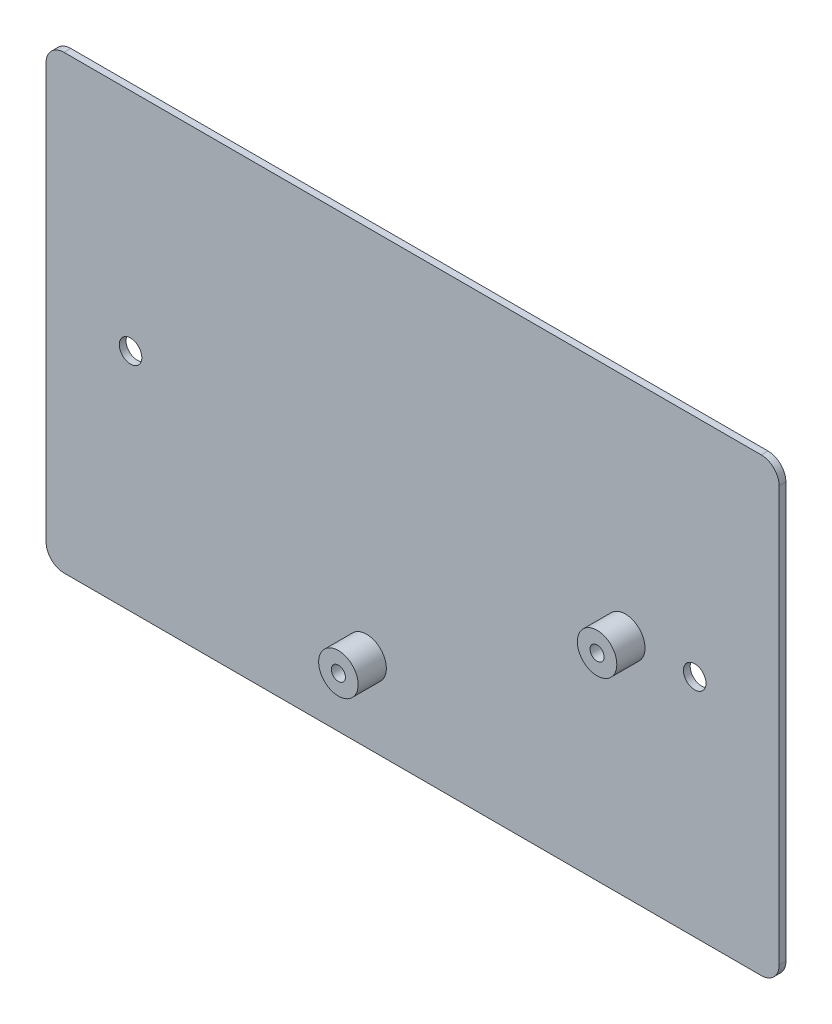
ISO-10303-21;
HEADER;
FILE_DESCRIPTION(('STEP AP214'),'2;1');
FILE_NAME('part.step','',(''),(''),'','','');
FILE_SCHEMA(('AUTOMOTIVE_DESIGN { 1 0 10303 214 1 1 1 1 }'));
ENDSEC;
DATA;
#1=APPLICATION_CONTEXT('core data for automotive mechanical design processes');
#2=APPLICATION_PROTOCOL_DEFINITION('international standard','automotive_design',2000,#1);
#3=PRODUCT_CONTEXT('',#1,'mechanical');
#4=PRODUCT('Part','Part','',(#3));
#5=PRODUCT_RELATED_PRODUCT_CATEGORY('part','',(#4));
#6=PRODUCT_DEFINITION_FORMATION('','',#4);
#7=PRODUCT_DEFINITION_CONTEXT('part definition',#1,'design');
#8=PRODUCT_DEFINITION('design','',#6,#7);
#9=PRODUCT_DEFINITION_SHAPE('','',#8);
#10=(LENGTH_UNIT() NAMED_UNIT(*) SI_UNIT(.MILLI.,.METRE.));
#11=(NAMED_UNIT(*) PLANE_ANGLE_UNIT() SI_UNIT($,.RADIAN.));
#12=(NAMED_UNIT(*) SI_UNIT($,.STERADIAN.) SOLID_ANGLE_UNIT());
#13=UNCERTAINTY_MEASURE_WITH_UNIT(LENGTH_MEASURE(1.E-05),#10,'distance_accuracy_value','');
#14=(GEOMETRIC_REPRESENTATION_CONTEXT(3) GLOBAL_UNCERTAINTY_ASSIGNED_CONTEXT((#13)) GLOBAL_UNIT_ASSIGNED_CONTEXT((#10,
#11,#12)) REPRESENTATION_CONTEXT('',''));
#15=CARTESIAN_POINT('',(0.,0.,0.));
#16=DIRECTION('',(0.,0.,1.));
#17=DIRECTION('',(1.,0.,0.));
#18=AXIS2_PLACEMENT_3D('',#15,#16,#17);
#19=CARTESIAN_POINT('',(0.,0.,1.2));
#20=DIRECTION('',(0.,0.,-1.));
#21=DIRECTION('',(-1.,0.,0.));
#22=AXIS2_PLACEMENT_3D('',#19,#20,#21);
#23=PLANE('',#22);
#24=CARTESIAN_POINT('',(-8.15692859579541,-26.04,1.2));
#25=DIRECTION('',(0.,0.,-1.));
#26=DIRECTION('',(-1.,0.,0.));
#27=AXIS2_PLACEMENT_3D('',#24,#25,#26);
#28=CIRCLE('',#27,3.5);
#29=CARTESIAN_POINT('',(-11.6569285957954,-26.04,1.2));
#30=VERTEX_POINT('',#29);
#31=EDGE_CURVE('E48',#30,#30,#28,.F.);
#32=ORIENTED_EDGE('',*,*,#31,.F.);
#33=EDGE_LOOP('',(#32));
#34=FACE_BOUND('',#33,.T.);
#35=CARTESIAN_POINT('',(-50.,0.,1.2));
#36=DIRECTION('',(0.,0.,1.));
#37=DIRECTION('',(1.,0.,0.));
#38=AXIS2_PLACEMENT_3D('',#35,#36,#37);
#39=CIRCLE('',#38,2.);
#40=CARTESIAN_POINT('',(-48.,0.,1.2));
#41=VERTEX_POINT('',#40);
#42=EDGE_CURVE('E197',#41,#41,#39,.T.);
#43=ORIENTED_EDGE('',*,*,#42,.F.);
#44=EDGE_LOOP('',(#43));
#45=FACE_BOUND('',#44,.T.);
#46=CARTESIAN_POINT('',(50.,0.,1.2));
#47=DIRECTION('',(0.,0.,1.));
#48=DIRECTION('',(-1.,0.,0.));
#49=AXIS2_PLACEMENT_3D('',#46,#47,#48);
#50=CIRCLE('',#49,2.);
#51=CARTESIAN_POINT('',(48.,0.,1.2));
#52=VERTEX_POINT('',#51);
#53=EDGE_CURVE('E200',#52,#52,#50,.T.);
#54=ORIENTED_EDGE('',*,*,#53,.F.);
#55=EDGE_LOOP('',(#54));
#56=FACE_BOUND('',#55,.T.);
#57=DIRECTION('',(-1.,0.,0.));
#58=VECTOR('',#57,1.);
#59=CARTESIAN_POINT('',(-64.965,39.965,1.2));
#60=LINE('',#59,#58);
#61=CARTESIAN_POINT('',(61.79,39.965,1.2));
#62=VERTEX_POINT('',#61);
#63=CARTESIAN_POINT('',(-61.79,39.965,1.2));
#64=VERTEX_POINT('',#63);
#65=EDGE_CURVE('E204',#62,#64,#60,.T.);
#66=ORIENTED_EDGE('',*,*,#65,.T.);
#67=CARTESIAN_POINT('',(-61.79,36.79,1.2));
#68=DIRECTION('',(0.,0.,-1.));
#69=DIRECTION('',(-1.,0.,0.));
#70=AXIS2_PLACEMENT_3D('',#67,#68,#69);
#71=CIRCLE('',#70,3.175);
#72=CARTESIAN_POINT('',(-64.965,36.79,1.2));
#73=VERTEX_POINT('',#72);
#74=EDGE_CURVE('E169',#64,#73,#71,.F.);
#75=ORIENTED_EDGE('',*,*,#74,.T.);
#76=DIRECTION('',(0.,-1.,0.));
#77=VECTOR('',#76,1.);
#78=CARTESIAN_POINT('',(-64.965,-39.965,1.2));
#79=LINE('',#78,#77);
#80=CARTESIAN_POINT('',(-64.965,-36.79,1.2));
#81=VERTEX_POINT('',#80);
#82=EDGE_CURVE('E127',#73,#81,#79,.T.);
#83=ORIENTED_EDGE('',*,*,#82,.T.);
#84=CARTESIAN_POINT('',(-61.79,-36.79,1.2));
#85=DIRECTION('',(0.,0.,-1.));
#86=DIRECTION('',(-1.,0.,0.));
#87=AXIS2_PLACEMENT_3D('',#84,#85,#86);
#88=CIRCLE('',#87,3.175);
#89=CARTESIAN_POINT('',(-61.79,-39.965,1.2));
#90=VERTEX_POINT('',#89);
#91=EDGE_CURVE('E62',#81,#90,#88,.F.);
#92=ORIENTED_EDGE('',*,*,#91,.T.);
#93=DIRECTION('',(1.,0.,0.));
#94=VECTOR('',#93,1.);
#95=CARTESIAN_POINT('',(-64.965,-39.965,1.2));
#96=LINE('',#95,#94);
#97=CARTESIAN_POINT('',(61.79,-39.965,1.2));
#98=VERTEX_POINT('',#97);
#99=EDGE_CURVE('E147',#90,#98,#96,.T.);
#100=ORIENTED_EDGE('',*,*,#99,.T.);
#101=CARTESIAN_POINT('',(61.79,-36.79,1.2));
#102=DIRECTION('',(0.,0.,-1.));
#103=DIRECTION('',(-1.,0.,0.));
#104=AXIS2_PLACEMENT_3D('',#101,#102,#103);
#105=CIRCLE('',#104,3.175);
#106=CARTESIAN_POINT('',(64.965,-36.79,1.2));
#107=VERTEX_POINT('',#106);
#108=EDGE_CURVE('E164',#98,#107,#105,.F.);
#109=ORIENTED_EDGE('',*,*,#108,.T.);
#110=DIRECTION('',(0.,1.,0.));
#111=VECTOR('',#110,1.);
#112=CARTESIAN_POINT('',(64.965,-39.965,1.2));
#113=LINE('',#112,#111);
#114=CARTESIAN_POINT('',(64.965,36.79,1.2));
#115=VERTEX_POINT('',#114);
#116=EDGE_CURVE('E140',#107,#115,#113,.T.);
#117=ORIENTED_EDGE('',*,*,#116,.T.);
#118=CARTESIAN_POINT('',(61.79,36.79,1.2));
#119=DIRECTION('',(0.,0.,-1.));
#120=DIRECTION('',(-1.,0.,0.));
#121=AXIS2_PLACEMENT_3D('',#118,#119,#120);
#122=CIRCLE('',#121,3.175);
#123=EDGE_CURVE('E161',#115,#62,#122,.F.);
#124=ORIENTED_EDGE('',*,*,#123,.T.);
#125=EDGE_LOOP('',(#66,#75,#83,#92,#100,#109,#117,#124));
#126=FACE_BOUND('',#125,.T.);
#127=CARTESIAN_POINT('',(37.6930714042046,0.,1.2));
#128=DIRECTION('',(0.,0.,-1.));
#129=DIRECTION('',(-1.,0.,0.));
#130=AXIS2_PLACEMENT_3D('',#127,#128,#129);
#131=CIRCLE('',#130,3.5);
#132=CARTESIAN_POINT('',(34.1930714042046,0.,1.2));
#133=VERTEX_POINT('',#132);
#134=EDGE_CURVE('E11',#133,#133,#131,.F.);
#135=ORIENTED_EDGE('',*,*,#134,.F.);
#136=EDGE_LOOP('',(#135));
#137=FACE_BOUND('',#136,.T.);
#138=ADVANCED_FACE('F39',(#34,#45,#56,#126,#137),#23,.F.);
#139=CARTESIAN_POINT('',(64.965,-39.965,1.2));
#140=DIRECTION('',(-1.,0.,0.));
#141=DIRECTION('',(0.,0.,1.));
#142=AXIS2_PLACEMENT_3D('',#139,#140,#141);
#143=PLANE('',#142);
#144=ORIENTED_EDGE('',*,*,#116,.F.);
#145=DIRECTION('',(0.,0.,-1.));
#146=VECTOR('',#145,1.);
#147=CARTESIAN_POINT('',(64.965,-36.79,1.2));
#148=LINE('',#147,#146);
#149=CARTESIAN_POINT('',(64.965,-36.79,0.));
#150=VERTEX_POINT('',#149);
#151=EDGE_CURVE('E181',#107,#150,#148,.T.);
#152=ORIENTED_EDGE('',*,*,#151,.T.);
#153=DIRECTION('',(0.,1.,0.));
#154=VECTOR('',#153,1.);
#155=CARTESIAN_POINT('',(64.965,-39.965,0.));
#156=LINE('',#155,#154);
#157=CARTESIAN_POINT('',(64.965,36.79,0.));
#158=VERTEX_POINT('',#157);
#159=EDGE_CURVE('E142',#150,#158,#156,.T.);
#160=ORIENTED_EDGE('',*,*,#159,.T.);
#161=DIRECTION('',(0.,0.,-1.));
#162=VECTOR('',#161,1.);
#163=CARTESIAN_POINT('',(64.965,36.79,1.2));
#164=LINE('',#163,#162);
#165=EDGE_CURVE('E178',#158,#115,#164,.F.);
#166=ORIENTED_EDGE('',*,*,#165,.T.);
#167=EDGE_LOOP('',(#144,#152,#160,#166));
#168=FACE_BOUND('',#167,.T.);
#169=ADVANCED_FACE('F192',(#168),#143,.F.);
#170=CARTESIAN_POINT('',(-64.965,39.965,1.2));
#171=DIRECTION('',(0.,-1.,0.));
#172=DIRECTION('',(0.,0.,-1.));
#173=AXIS2_PLACEMENT_3D('',#170,#171,#172);
#174=PLANE('',#173);
#175=DIRECTION('',(-1.,0.,0.));
#176=VECTOR('',#175,1.);
#177=CARTESIAN_POINT('',(-64.965,39.965,0.));
#178=LINE('',#177,#176);
#179=CARTESIAN_POINT('',(61.79,39.965,0.));
#180=VERTEX_POINT('',#179);
#181=CARTESIAN_POINT('',(-61.79,39.965,0.));
#182=VERTEX_POINT('',#181);
#183=EDGE_CURVE('E136',#180,#182,#178,.T.);
#184=ORIENTED_EDGE('',*,*,#183,.T.);
#185=DIRECTION('',(0.,0.,-1.));
#186=VECTOR('',#185,1.);
#187=CARTESIAN_POINT('',(-61.79,39.965,1.2));
#188=LINE('',#187,#186);
#189=EDGE_CURVE('E112',#182,#64,#188,.F.);
#190=ORIENTED_EDGE('',*,*,#189,.T.);
#191=ORIENTED_EDGE('',*,*,#65,.F.);
#192=DIRECTION('',(0.,0.,-1.));
#193=VECTOR('',#192,1.);
#194=CARTESIAN_POINT('',(61.79,39.965,1.2));
#195=LINE('',#194,#193);
#196=EDGE_CURVE('E118',#62,#180,#195,.T.);
#197=ORIENTED_EDGE('',*,*,#196,.T.);
#198=EDGE_LOOP('',(#184,#190,#191,#197));
#199=FACE_BOUND('',#198,.T.);
#200=ADVANCED_FACE('F250',(#199),#174,.F.);
#201=CARTESIAN_POINT('',(-64.965,-39.965,1.2));
#202=DIRECTION('',(1.,0.,0.));
#203=DIRECTION('',(0.,0.,-1.));
#204=AXIS2_PLACEMENT_3D('',#201,#202,#203);
#205=PLANE('',#204);
#206=ORIENTED_EDGE('',*,*,#82,.F.);
#207=DIRECTION('',(0.,0.,-1.));
#208=VECTOR('',#207,1.);
#209=CARTESIAN_POINT('',(-64.965,36.79,1.2));
#210=LINE('',#209,#208);
#211=CARTESIAN_POINT('',(-64.965,36.79,0.));
#212=VERTEX_POINT('',#211);
#213=EDGE_CURVE('E111',#73,#212,#210,.T.);
#214=ORIENTED_EDGE('',*,*,#213,.T.);
#215=DIRECTION('',(0.,-1.,0.));
#216=VECTOR('',#215,1.);
#217=CARTESIAN_POINT('',(-64.965,-39.965,0.));
#218=LINE('',#217,#216);
#219=CARTESIAN_POINT('',(-64.965,-36.79,0.));
#220=VERTEX_POINT('',#219);
#221=EDGE_CURVE('E125',#212,#220,#218,.T.);
#222=ORIENTED_EDGE('',*,*,#221,.T.);
#223=DIRECTION('',(0.,0.,-1.));
#224=VECTOR('',#223,1.);
#225=CARTESIAN_POINT('',(-64.965,-36.79,1.2));
#226=LINE('',#225,#224);
#227=EDGE_CURVE('E130',#220,#81,#226,.F.);
#228=ORIENTED_EDGE('',*,*,#227,.T.);
#229=EDGE_LOOP('',(#206,#214,#222,#228));
#230=FACE_BOUND('',#229,.T.);
#231=ADVANCED_FACE('F124',(#230),#205,.F.);
#232=CARTESIAN_POINT('',(-64.965,-39.965,1.2));
#233=DIRECTION('',(0.,1.,0.));
#234=DIRECTION('',(0.,0.,1.));
#235=AXIS2_PLACEMENT_3D('',#232,#233,#234);
#236=PLANE('',#235);
#237=ORIENTED_EDGE('',*,*,#99,.F.);
#238=DIRECTION('',(0.,0.,-1.));
#239=VECTOR('',#238,1.);
#240=CARTESIAN_POINT('',(-61.79,-39.965,1.2));
#241=LINE('',#240,#239);
#242=CARTESIAN_POINT('',(-61.79,-39.965,0.));
#243=VERTEX_POINT('',#242);
#244=EDGE_CURVE('E174',#90,#243,#241,.T.);
#245=ORIENTED_EDGE('',*,*,#244,.T.);
#246=DIRECTION('',(1.,0.,0.));
#247=VECTOR('',#246,1.);
#248=CARTESIAN_POINT('',(-64.965,-39.965,0.));
#249=LINE('',#248,#247);
#250=CARTESIAN_POINT('',(61.79,-39.965,0.));
#251=VERTEX_POINT('',#250);
#252=EDGE_CURVE('E135',#243,#251,#249,.T.);
#253=ORIENTED_EDGE('',*,*,#252,.T.);
#254=DIRECTION('',(0.,0.,-1.));
#255=VECTOR('',#254,1.);
#256=CARTESIAN_POINT('',(61.79,-39.965,1.2));
#257=LINE('',#256,#255);
#258=EDGE_CURVE('E55',#251,#98,#257,.F.);
#259=ORIENTED_EDGE('',*,*,#258,.T.);
#260=EDGE_LOOP('',(#237,#245,#253,#259));
#261=FACE_BOUND('',#260,.T.);
#262=ADVANCED_FACE('F244',(#261),#236,.F.);
#263=CARTESIAN_POINT('',(0.,0.,0.));
#264=DIRECTION('',(0.,0.,-1.));
#265=DIRECTION('',(-1.,0.,0.));
#266=AXIS2_PLACEMENT_3D('',#263,#264,#265);
#267=PLANE('',#266);
#268=CARTESIAN_POINT('',(-8.15692859579541,-26.04,0.));
#269=DIRECTION('',(0.,0.,-1.));
#270=DIRECTION('',(-1.,0.,0.));
#271=AXIS2_PLACEMENT_3D('',#268,#269,#270);
#272=CIRCLE('',#271,1.25);
#273=CARTESIAN_POINT('',(-9.40692859579541,-26.04,0.));
#274=VERTEX_POINT('',#273);
#275=EDGE_CURVE('E303',#274,#274,#272,.F.);
#276=ORIENTED_EDGE('',*,*,#275,.T.);
#277=EDGE_LOOP('',(#276));
#278=FACE_BOUND('',#277,.T.);
#279=CARTESIAN_POINT('',(37.6930714042046,0.,0.));
#280=DIRECTION('',(0.,0.,-1.));
#281=DIRECTION('',(-1.,0.,0.));
#282=AXIS2_PLACEMENT_3D('',#279,#280,#281);
#283=CIRCLE('',#282,1.25);
#284=CARTESIAN_POINT('',(36.4430714042046,0.,0.));
#285=VERTEX_POINT('',#284);
#286=EDGE_CURVE('E297',#285,#285,#283,.F.);
#287=ORIENTED_EDGE('',*,*,#286,.T.);
#288=EDGE_LOOP('',(#287));
#289=FACE_BOUND('',#288,.T.);
#290=CARTESIAN_POINT('',(-50.,0.,0.));
#291=DIRECTION('',(0.,0.,-1.));
#292=DIRECTION('',(-1.,0.,0.));
#293=AXIS2_PLACEMENT_3D('',#290,#291,#292);
#294=CIRCLE('',#293,2.);
#295=CARTESIAN_POINT('',(-52.,0.,0.));
#296=VERTEX_POINT('',#295);
#297=EDGE_CURVE('E290',#296,#296,#294,.F.);
#298=ORIENTED_EDGE('',*,*,#297,.T.);
#299=EDGE_LOOP('',(#298));
#300=FACE_BOUND('',#299,.T.);
#301=CARTESIAN_POINT('',(50.,0.,0.));
#302=DIRECTION('',(0.,0.,-1.));
#303=DIRECTION('',(-1.,0.,0.));
#304=AXIS2_PLACEMENT_3D('',#301,#302,#303);
#305=CIRCLE('',#304,2.);
#306=CARTESIAN_POINT('',(48.,0.,0.));
#307=VERTEX_POINT('',#306);
#308=EDGE_CURVE('E282',#307,#307,#305,.F.);
#309=ORIENTED_EDGE('',*,*,#308,.T.);
#310=EDGE_LOOP('',(#309));
#311=FACE_BOUND('',#310,.T.);
#312=ORIENTED_EDGE('',*,*,#221,.F.);
#313=CARTESIAN_POINT('',(-61.79,36.79,0.));
#314=DIRECTION('',(0.,0.,-1.));
#315=DIRECTION('',(-1.,0.,0.));
#316=AXIS2_PLACEMENT_3D('',#313,#314,#315);
#317=CIRCLE('',#316,3.175);
#318=EDGE_CURVE('E107',#212,#182,#317,.T.);
#319=ORIENTED_EDGE('',*,*,#318,.T.);
#320=ORIENTED_EDGE('',*,*,#183,.F.);
#321=CARTESIAN_POINT('',(61.79,36.79,0.));
#322=DIRECTION('',(0.,0.,-1.));
#323=DIRECTION('',(-1.,0.,0.));
#324=AXIS2_PLACEMENT_3D('',#321,#322,#323);
#325=CIRCLE('',#324,3.175);
#326=EDGE_CURVE('E129',#180,#158,#325,.T.);
#327=ORIENTED_EDGE('',*,*,#326,.T.);
#328=ORIENTED_EDGE('',*,*,#159,.F.);
#329=CARTESIAN_POINT('',(61.79,-36.79,0.));
#330=DIRECTION('',(0.,0.,-1.));
#331=DIRECTION('',(-1.,0.,0.));
#332=AXIS2_PLACEMENT_3D('',#329,#330,#331);
#333=CIRCLE('',#332,3.175);
#334=EDGE_CURVE('E151',#150,#251,#333,.T.);
#335=ORIENTED_EDGE('',*,*,#334,.T.);
#336=ORIENTED_EDGE('',*,*,#252,.F.);
#337=CARTESIAN_POINT('',(-61.79,-36.79,0.));
#338=DIRECTION('',(0.,0.,-1.));
#339=DIRECTION('',(-1.,0.,0.));
#340=AXIS2_PLACEMENT_3D('',#337,#338,#339);
#341=CIRCLE('',#340,3.175);
#342=EDGE_CURVE('E119',#243,#220,#341,.T.);
#343=ORIENTED_EDGE('',*,*,#342,.T.);
#344=EDGE_LOOP('',(#312,#319,#320,#327,#328,#335,#336,#343));
#345=FACE_BOUND('',#344,.T.);
#346=ADVANCED_FACE('F132',(#278,#289,#300,#311,#345),#267,.T.);
#347=CARTESIAN_POINT('',(-61.79,36.79,1.2));
#348=DIRECTION('',(0.,0.,-1.));
#349=DIRECTION('',(-1.,0.,0.));
#350=AXIS2_PLACEMENT_3D('',#347,#348,#349);
#351=CYLINDRICAL_SURFACE('',#350,3.175);
#352=ORIENTED_EDGE('',*,*,#74,.F.);
#353=ORIENTED_EDGE('',*,*,#189,.F.);
#354=ORIENTED_EDGE('',*,*,#318,.F.);
#355=ORIENTED_EDGE('',*,*,#213,.F.);
#356=EDGE_LOOP('',(#352,#353,#354,#355));
#357=FACE_BOUND('',#356,.T.);
#358=ADVANCED_FACE('F110',(#357),#351,.T.);
#359=CARTESIAN_POINT('',(-61.79,-36.79,1.2));
#360=DIRECTION('',(0.,0.,-1.));
#361=DIRECTION('',(-1.,0.,0.));
#362=AXIS2_PLACEMENT_3D('',#359,#360,#361);
#363=CYLINDRICAL_SURFACE('',#362,3.175);
#364=ORIENTED_EDGE('',*,*,#91,.F.);
#365=ORIENTED_EDGE('',*,*,#227,.F.);
#366=ORIENTED_EDGE('',*,*,#342,.F.);
#367=ORIENTED_EDGE('',*,*,#244,.F.);
#368=EDGE_LOOP('',(#364,#365,#366,#367));
#369=FACE_BOUND('',#368,.T.);
#370=ADVANCED_FACE('F259',(#369),#363,.T.);
#371=CARTESIAN_POINT('',(61.79,-36.79,1.2));
#372=DIRECTION('',(0.,0.,-1.));
#373=DIRECTION('',(-1.,0.,0.));
#374=AXIS2_PLACEMENT_3D('',#371,#372,#373);
#375=CYLINDRICAL_SURFACE('',#374,3.175);
#376=ORIENTED_EDGE('',*,*,#108,.F.);
#377=ORIENTED_EDGE('',*,*,#258,.F.);
#378=ORIENTED_EDGE('',*,*,#334,.F.);
#379=ORIENTED_EDGE('',*,*,#151,.F.);
#380=EDGE_LOOP('',(#376,#377,#378,#379));
#381=FACE_BOUND('',#380,.T.);
#382=ADVANCED_FACE('F261',(#381),#375,.T.);
#383=CARTESIAN_POINT('',(61.79,36.79,1.2));
#384=DIRECTION('',(0.,0.,-1.));
#385=DIRECTION('',(-1.,0.,0.));
#386=AXIS2_PLACEMENT_3D('',#383,#384,#385);
#387=CYLINDRICAL_SURFACE('',#386,3.175);
#388=ORIENTED_EDGE('',*,*,#123,.F.);
#389=ORIENTED_EDGE('',*,*,#165,.F.);
#390=ORIENTED_EDGE('',*,*,#326,.F.);
#391=ORIENTED_EDGE('',*,*,#196,.F.);
#392=EDGE_LOOP('',(#388,#389,#390,#391));
#393=FACE_BOUND('',#392,.T.);
#394=ADVANCED_FACE('F41',(#393),#387,.T.);
#395=CARTESIAN_POINT('',(50.,0.,-0.000999999999999916));
#396=DIRECTION('',(0.,0.,1.));
#397=DIRECTION('',(1.,0.,0.));
#398=AXIS2_PLACEMENT_3D('',#395,#396,#397);
#399=CYLINDRICAL_SURFACE('',#398,2.);
#400=ORIENTED_EDGE('',*,*,#308,.F.);
#401=EDGE_LOOP('',(#400));
#402=FACE_BOUND('',#401,.T.);
#403=ORIENTED_EDGE('',*,*,#53,.T.);
#404=EDGE_LOOP('',(#403));
#405=FACE_BOUND('',#404,.T.);
#406=ADVANCED_FACE('F237',(#402,#405),#399,.F.);
#407=CARTESIAN_POINT('',(-50.,0.,-0.000999999999999916));
#408=DIRECTION('',(0.,0.,1.));
#409=DIRECTION('',(1.,0.,0.));
#410=AXIS2_PLACEMENT_3D('',#407,#408,#409);
#411=CYLINDRICAL_SURFACE('',#410,2.);
#412=ORIENTED_EDGE('',*,*,#297,.F.);
#413=EDGE_LOOP('',(#412));
#414=FACE_BOUND('',#413,.T.);
#415=ORIENTED_EDGE('',*,*,#42,.T.);
#416=EDGE_LOOP('',(#415));
#417=FACE_BOUND('',#416,.T.);
#418=ADVANCED_FACE('F233',(#414,#417),#411,.F.);
#419=CARTESIAN_POINT('',(37.6930714042046,0.,1.200012));
#420=DIRECTION('',(0.,0.,-1.));
#421=DIRECTION('',(-1.,0.,0.));
#422=AXIS2_PLACEMENT_3D('',#419,#420,#421);
#423=CYLINDRICAL_SURFACE('',#422,1.25);
#424=CARTESIAN_POINT('',(37.6930714042046,0.,6.2));
#425=DIRECTION('',(0.,0.,1.));
#426=DIRECTION('',(1.,0.,0.));
#427=AXIS2_PLACEMENT_3D('',#424,#425,#426);
#428=CIRCLE('',#427,1.25);
#429=CARTESIAN_POINT('',(36.4430714042046,0.,6.2));
#430=VERTEX_POINT('',#429);
#431=EDGE_CURVE('E324',#430,#430,#428,.T.);
#432=CARTESIAN_POINT('',(36.4430714042046,0.,0.));
#433=CARTESIAN_POINT('',(36.4430714042046,0.,0.0645833333333335));
#434=CARTESIAN_POINT('',(36.4430714042046,0.,0.129166666666667));
#435=CARTESIAN_POINT('',(36.4430714042046,0.,0.258333333333334));
#436=CARTESIAN_POINT('',(36.4430714042046,0.,0.322916666666667));
#437=CARTESIAN_POINT('',(36.4430714042046,0.,0.452083333333333));
#438=CARTESIAN_POINT('',(36.4430714042046,0.,0.516666666666667));
#439=CARTESIAN_POINT('',(36.4430714042046,0.,0.645833333333333));
#440=CARTESIAN_POINT('',(36.4430714042046,0.,0.710416666666667));
#441=CARTESIAN_POINT('',(36.4430714042046,0.,0.839583333333333));
#442=CARTESIAN_POINT('',(36.4430714042046,0.,0.904166666666667));
#443=CARTESIAN_POINT('',(36.4430714042046,0.,1.03333333333333));
#444=CARTESIAN_POINT('',(36.4430714042046,0.,1.09791666666667));
#445=CARTESIAN_POINT('',(36.4430714042046,0.,1.22708333333333));
#446=CARTESIAN_POINT('',(36.4430714042046,0.,1.29166666666667));
#447=CARTESIAN_POINT('',(36.4430714042046,0.,1.42083333333333));
#448=CARTESIAN_POINT('',(36.4430714042046,0.,1.48541666666667));
#449=CARTESIAN_POINT('',(36.4430714042046,0.,1.61458333333333));
#450=CARTESIAN_POINT('',(36.4430714042046,0.,1.67916666666667));
#451=CARTESIAN_POINT('',(36.4430714042046,0.,1.80833333333333));
#452=CARTESIAN_POINT('',(36.4430714042046,0.,1.87291666666667));
#453=CARTESIAN_POINT('',(36.4430714042046,0.,2.00208333333333));
#454=CARTESIAN_POINT('',(36.4430714042046,0.,2.06666666666667));
#455=CARTESIAN_POINT('',(36.4430714042046,0.,2.19583333333333));
#456=CARTESIAN_POINT('',(36.4430714042046,0.,2.26041666666667));
#457=CARTESIAN_POINT('',(36.4430714042046,0.,2.38958333333333));
#458=CARTESIAN_POINT('',(36.4430714042046,0.,2.45416666666667));
#459=CARTESIAN_POINT('',(36.4430714042046,0.,2.58333333333333));
#460=CARTESIAN_POINT('',(36.4430714042046,0.,2.64791666666667));
#461=CARTESIAN_POINT('',(36.4430714042046,0.,2.77708333333333));
#462=CARTESIAN_POINT('',(36.4430714042046,0.,2.84166666666667));
#463=CARTESIAN_POINT('',(36.4430714042046,0.,2.97083333333333));
#464=CARTESIAN_POINT('',(36.4430714042046,0.,3.03541666666667));
#465=CARTESIAN_POINT('',(36.4430714042046,0.,3.16458333333333));
#466=CARTESIAN_POINT('',(36.4430714042046,0.,3.22916666666667));
#467=CARTESIAN_POINT('',(36.4430714042046,0.,3.35833333333333));
#468=CARTESIAN_POINT('',(36.4430714042046,0.,3.42291666666667));
#469=CARTESIAN_POINT('',(36.4430714042046,0.,3.55208333333333));
#470=CARTESIAN_POINT('',(36.4430714042046,0.,3.61666666666667));
#471=CARTESIAN_POINT('',(36.4430714042046,0.,3.74583333333333));
#472=CARTESIAN_POINT('',(36.4430714042046,0.,3.81041666666667));
#473=CARTESIAN_POINT('',(36.4430714042046,0.,3.93958333333333));
#474=CARTESIAN_POINT('',(36.4430714042046,0.,4.00416666666667));
#475=CARTESIAN_POINT('',(36.4430714042046,0.,4.13333333333333));
#476=CARTESIAN_POINT('',(36.4430714042046,0.,4.19791666666667));
#477=CARTESIAN_POINT('',(36.4430714042046,0.,4.32708333333333));
#478=CARTESIAN_POINT('',(36.4430714042046,0.,4.39166666666667));
#479=CARTESIAN_POINT('',(36.4430714042046,0.,4.52083333333333));
#480=CARTESIAN_POINT('',(36.4430714042046,0.,4.58541666666667));
#481=CARTESIAN_POINT('',(36.4430714042046,0.,4.71458333333333));
#482=CARTESIAN_POINT('',(36.4430714042046,0.,4.77916666666667));
#483=CARTESIAN_POINT('',(36.4430714042046,0.,4.90833333333333));
#484=CARTESIAN_POINT('',(36.4430714042046,0.,4.97291666666667));
#485=CARTESIAN_POINT('',(36.4430714042046,0.,5.10208333333333));
#486=CARTESIAN_POINT('',(36.4430714042046,0.,5.16666666666667));
#487=CARTESIAN_POINT('',(36.4430714042046,0.,5.29583333333333));
#488=CARTESIAN_POINT('',(36.4430714042046,0.,5.36041666666667));
#489=CARTESIAN_POINT('',(36.4430714042046,0.,5.48958333333333));
#490=CARTESIAN_POINT('',(36.4430714042046,0.,5.55416666666667));
#491=CARTESIAN_POINT('',(36.4430714042046,0.,5.68333333333333));
#492=CARTESIAN_POINT('',(36.4430714042046,0.,5.74791666666667));
#493=CARTESIAN_POINT('',(36.4430714042046,0.,5.87708333333333));
#494=CARTESIAN_POINT('',(36.4430714042046,0.,5.94166666666667));
#495=CARTESIAN_POINT('',(36.4430714042046,0.,6.07083333333333));
#496=CARTESIAN_POINT('',(36.4430714042046,0.,6.13541666666667));
#497=CARTESIAN_POINT('',(36.4430714042046,0.,6.2));
#498=B_SPLINE_CURVE_WITH_KNOTS('',3,(#432,#433,#434,#435,#436,#437,#438,#439,#440,#441,#442,
#443,#444,#445,#446,#447,#448,#449,#450,#451,#452,#453,#454,#455,#456,#457,#458,#459,#460,#461,
#462,#463,#464,#465,#466,#467,#468,#469,#470,#471,#472,#473,#474,#475,#476,#477,#478,#479,#480,
#481,#482,#483,#484,#485,#486,#487,#488,#489,#490,#491,#492,#493,#494,#495,#496,#497),
.UNSPECIFIED.,.F.,.F.,(4,2,2,2,2,2,2,2,2,2,2,2,2,2,2,2,2,2,2,2,2,2,2,2,2,2,2,2,2,2,2,2,4),(0.,
0.19375,0.3875,0.58125,0.775,0.96875,1.1625,1.35625,1.55,1.74375,1.9375,2.13125,2.325,2.51875,
2.7125,2.90625,3.1,3.29375,3.4875,3.68125,3.875,4.06875,4.2625,4.45625,4.65,4.84375,5.0375,
5.23125,5.425,5.61875,5.8125,6.00625,6.2),.UNSPECIFIED.);
#499=EDGE_CURVE('BSEAM229',#285,#430,#498,.T.);
#500=ORIENTED_EDGE('',*,*,#286,.F.);
#501=ORIENTED_EDGE('',*,*,#431,.T.);
#502=ORIENTED_EDGE('',*,*,#499,.T.);
#503=ORIENTED_EDGE('',*,*,#499,.F.);
#504=EDGE_LOOP('',(#500,#502,#501,#503));
#505=FACE_BOUND('',#504,.T.);
#506=ADVANCED_FACE('F229',(#505),#423,.F.);
#507=CARTESIAN_POINT('',(-8.15692859579541,-26.04,1.200012));
#508=DIRECTION('',(0.,0.,-1.));
#509=DIRECTION('',(-1.,0.,0.));
#510=AXIS2_PLACEMENT_3D('',#507,#508,#509);
#511=CYLINDRICAL_SURFACE('',#510,1.25);
#512=CARTESIAN_POINT('',(-8.15692859579541,-26.04,6.2));
#513=DIRECTION('',(0.,0.,1.));
#514=DIRECTION('',(1.,0.,0.));
#515=AXIS2_PLACEMENT_3D('',#512,#513,#514);
#516=CIRCLE('',#515,1.25);
#517=CARTESIAN_POINT('',(-9.40692859579541,-26.04,6.2));
#518=VERTEX_POINT('',#517);
#519=EDGE_CURVE('E316',#518,#518,#516,.T.);
#520=CARTESIAN_POINT('',(-9.40692859579541,-26.04,0.));
#521=CARTESIAN_POINT('',(-9.40692859579541,-26.04,0.0645833333333335));
#522=CARTESIAN_POINT('',(-9.40692859579541,-26.04,0.129166666666667));
#523=CARTESIAN_POINT('',(-9.40692859579541,-26.04,0.258333333333334));
#524=CARTESIAN_POINT('',(-9.40692859579541,-26.04,0.322916666666667));
#525=CARTESIAN_POINT('',(-9.40692859579541,-26.04,0.452083333333333));
#526=CARTESIAN_POINT('',(-9.40692859579541,-26.04,0.516666666666667));
#527=CARTESIAN_POINT('',(-9.40692859579541,-26.04,0.645833333333333));
#528=CARTESIAN_POINT('',(-9.40692859579541,-26.04,0.710416666666667));
#529=CARTESIAN_POINT('',(-9.40692859579541,-26.04,0.839583333333333));
#530=CARTESIAN_POINT('',(-9.40692859579541,-26.04,0.904166666666667));
#531=CARTESIAN_POINT('',(-9.40692859579541,-26.04,1.03333333333333));
#532=CARTESIAN_POINT('',(-9.40692859579541,-26.04,1.09791666666667));
#533=CARTESIAN_POINT('',(-9.40692859579541,-26.04,1.22708333333333));
#534=CARTESIAN_POINT('',(-9.40692859579541,-26.04,1.29166666666667));
#535=CARTESIAN_POINT('',(-9.40692859579541,-26.04,1.42083333333333));
#536=CARTESIAN_POINT('',(-9.40692859579541,-26.04,1.48541666666667));
#537=CARTESIAN_POINT('',(-9.40692859579541,-26.04,1.61458333333333));
#538=CARTESIAN_POINT('',(-9.40692859579541,-26.04,1.67916666666667));
#539=CARTESIAN_POINT('',(-9.40692859579541,-26.04,1.80833333333333));
#540=CARTESIAN_POINT('',(-9.40692859579541,-26.04,1.87291666666667));
#541=CARTESIAN_POINT('',(-9.40692859579541,-26.04,2.00208333333333));
#542=CARTESIAN_POINT('',(-9.40692859579541,-26.04,2.06666666666667));
#543=CARTESIAN_POINT('',(-9.40692859579541,-26.04,2.19583333333333));
#544=CARTESIAN_POINT('',(-9.40692859579541,-26.04,2.26041666666667));
#545=CARTESIAN_POINT('',(-9.40692859579541,-26.04,2.38958333333333));
#546=CARTESIAN_POINT('',(-9.40692859579541,-26.04,2.45416666666667));
#547=CARTESIAN_POINT('',(-9.40692859579541,-26.04,2.58333333333333));
#548=CARTESIAN_POINT('',(-9.40692859579541,-26.04,2.64791666666667));
#549=CARTESIAN_POINT('',(-9.40692859579541,-26.04,2.77708333333333));
#550=CARTESIAN_POINT('',(-9.40692859579541,-26.04,2.84166666666667));
#551=CARTESIAN_POINT('',(-9.40692859579541,-26.04,2.97083333333333));
#552=CARTESIAN_POINT('',(-9.40692859579541,-26.04,3.03541666666667));
#553=CARTESIAN_POINT('',(-9.40692859579541,-26.04,3.16458333333333));
#554=CARTESIAN_POINT('',(-9.40692859579541,-26.04,3.22916666666667));
#555=CARTESIAN_POINT('',(-9.40692859579541,-26.04,3.35833333333333));
#556=CARTESIAN_POINT('',(-9.40692859579541,-26.04,3.42291666666667));
#557=CARTESIAN_POINT('',(-9.40692859579541,-26.04,3.55208333333333));
#558=CARTESIAN_POINT('',(-9.40692859579541,-26.04,3.61666666666667));
#559=CARTESIAN_POINT('',(-9.40692859579541,-26.04,3.74583333333333));
#560=CARTESIAN_POINT('',(-9.40692859579541,-26.04,3.81041666666667));
#561=CARTESIAN_POINT('',(-9.40692859579541,-26.04,3.93958333333333));
#562=CARTESIAN_POINT('',(-9.40692859579541,-26.04,4.00416666666667));
#563=CARTESIAN_POINT('',(-9.40692859579541,-26.04,4.13333333333333));
#564=CARTESIAN_POINT('',(-9.40692859579541,-26.04,4.19791666666667));
#565=CARTESIAN_POINT('',(-9.40692859579541,-26.04,4.32708333333333));
#566=CARTESIAN_POINT('',(-9.40692859579541,-26.04,4.39166666666667));
#567=CARTESIAN_POINT('',(-9.40692859579541,-26.04,4.52083333333333));
#568=CARTESIAN_POINT('',(-9.40692859579541,-26.04,4.58541666666667));
#569=CARTESIAN_POINT('',(-9.40692859579541,-26.04,4.71458333333333));
#570=CARTESIAN_POINT('',(-9.40692859579541,-26.04,4.77916666666667));
#571=CARTESIAN_POINT('',(-9.40692859579541,-26.04,4.90833333333333));
#572=CARTESIAN_POINT('',(-9.40692859579541,-26.04,4.97291666666667));
#573=CARTESIAN_POINT('',(-9.40692859579541,-26.04,5.10208333333333));
#574=CARTESIAN_POINT('',(-9.40692859579541,-26.04,5.16666666666667));
#575=CARTESIAN_POINT('',(-9.40692859579541,-26.04,5.29583333333333));
#576=CARTESIAN_POINT('',(-9.40692859579541,-26.04,5.36041666666667));
#577=CARTESIAN_POINT('',(-9.40692859579541,-26.04,5.48958333333333));
#578=CARTESIAN_POINT('',(-9.40692859579541,-26.04,5.55416666666667));
#579=CARTESIAN_POINT('',(-9.40692859579541,-26.04,5.68333333333333));
#580=CARTESIAN_POINT('',(-9.40692859579541,-26.04,5.74791666666667));
#581=CARTESIAN_POINT('',(-9.40692859579541,-26.04,5.87708333333333));
#582=CARTESIAN_POINT('',(-9.40692859579541,-26.04,5.94166666666667));
#583=CARTESIAN_POINT('',(-9.40692859579541,-26.04,6.07083333333333));
#584=CARTESIAN_POINT('',(-9.40692859579541,-26.04,6.13541666666667));
#585=CARTESIAN_POINT('',(-9.40692859579541,-26.04,6.2));
#586=B_SPLINE_CURVE_WITH_KNOTS('',3,(#520,#521,#522,#523,#524,#525,#526,#527,#528,#529,#530,
#531,#532,#533,#534,#535,#536,#537,#538,#539,#540,#541,#542,#543,#544,#545,#546,#547,#548,#549,
#550,#551,#552,#553,#554,#555,#556,#557,#558,#559,#560,#561,#562,#563,#564,#565,#566,#567,#568,
#569,#570,#571,#572,#573,#574,#575,#576,#577,#578,#579,#580,#581,#582,#583,#584,#585),
.UNSPECIFIED.,.F.,.F.,(4,2,2,2,2,2,2,2,2,2,2,2,2,2,2,2,2,2,2,2,2,2,2,2,2,2,2,2,2,2,2,2,4),(0.,
0.19375,0.3875,0.58125,0.775,0.96875,1.1625,1.35625,1.55,1.74375,1.9375,2.13125,2.325,2.51875,
2.7125,2.90625,3.1,3.29375,3.4875,3.68125,3.875,4.06875,4.2625,4.45625,4.65,4.84375,5.0375,
5.23125,5.425,5.61875,5.8125,6.00625,6.2),.UNSPECIFIED.);
#587=EDGE_CURVE('BSEAM222',#274,#518,#586,.T.);
#588=ORIENTED_EDGE('',*,*,#275,.F.);
#589=ORIENTED_EDGE('',*,*,#519,.T.);
#590=ORIENTED_EDGE('',*,*,#587,.T.);
#591=ORIENTED_EDGE('',*,*,#587,.F.);
#592=EDGE_LOOP('',(#588,#590,#589,#591));
#593=FACE_BOUND('',#592,.T.);
#594=ADVANCED_FACE('F222',(#593),#511,.F.);
#595=CARTESIAN_POINT('',(-8.15692859579541,-26.04,6.2));
#596=DIRECTION('',(0.,0.,1.));
#597=DIRECTION('',(1.,0.,0.));
#598=AXIS2_PLACEMENT_3D('',#595,#596,#597);
#599=PLANE('',#598);
#600=CARTESIAN_POINT('',(-8.15692859579541,-26.04,6.2));
#601=DIRECTION('',(0.,0.,1.));
#602=DIRECTION('',(1.,0.,0.));
#603=AXIS2_PLACEMENT_3D('',#600,#601,#602);
#604=CIRCLE('',#603,3.5);
#605=CARTESIAN_POINT('',(-4.65692859579541,-26.04,6.2));
#606=VERTEX_POINT('',#605);
#607=EDGE_CURVE('E311',#606,#606,#604,.T.);
#608=ORIENTED_EDGE('',*,*,#607,.T.);
#609=EDGE_LOOP('',(#608));
#610=FACE_BOUND('',#609,.T.);
#611=ORIENTED_EDGE('',*,*,#519,.F.);
#612=EDGE_LOOP('',(#611));
#613=FACE_BOUND('',#612,.T.);
#614=ADVANCED_FACE('F219',(#610,#613),#599,.T.);
#615=CARTESIAN_POINT('',(-8.15692859579541,-26.04,6.2));
#616=DIRECTION('',(0.,0.,-1.));
#617=DIRECTION('',(-1.,0.,0.));
#618=AXIS2_PLACEMENT_3D('',#615,#616,#617);
#619=CYLINDRICAL_SURFACE('',#618,3.5);
#620=ORIENTED_EDGE('',*,*,#607,.F.);
#621=EDGE_LOOP('',(#620));
#622=FACE_BOUND('',#621,.T.);
#623=ORIENTED_EDGE('',*,*,#31,.T.);
#624=EDGE_LOOP('',(#623));
#625=FACE_BOUND('',#624,.T.);
#626=ADVANCED_FACE('F188',(#622,#625),#619,.T.);
#627=CARTESIAN_POINT('',(37.6930714042046,0.,6.2));
#628=DIRECTION('',(0.,0.,1.));
#629=DIRECTION('',(1.,0.,0.));
#630=AXIS2_PLACEMENT_3D('',#627,#628,#629);
#631=PLANE('',#630);
#632=CARTESIAN_POINT('',(37.6930714042046,0.,6.2));
#633=DIRECTION('',(0.,0.,1.));
#634=DIRECTION('',(1.,0.,0.));
#635=AXIS2_PLACEMENT_3D('',#632,#633,#634);
#636=CIRCLE('',#635,3.5);
#637=CARTESIAN_POINT('',(41.1930714042046,0.,6.2));
#638=VERTEX_POINT('',#637);
#639=EDGE_CURVE('E320',#638,#638,#636,.T.);
#640=ORIENTED_EDGE('',*,*,#639,.T.);
#641=EDGE_LOOP('',(#640));
#642=FACE_BOUND('',#641,.T.);
#643=ORIENTED_EDGE('',*,*,#431,.F.);
#644=EDGE_LOOP('',(#643));
#645=FACE_BOUND('',#644,.T.);
#646=ADVANCED_FACE('F209',(#642,#645),#631,.T.);
#647=CARTESIAN_POINT('',(37.6930714042046,0.,6.2));
#648=DIRECTION('',(0.,0.,-1.));
#649=DIRECTION('',(-1.,0.,0.));
#650=AXIS2_PLACEMENT_3D('',#647,#648,#649);
#651=CYLINDRICAL_SURFACE('',#650,3.5);
#652=ORIENTED_EDGE('',*,*,#639,.F.);
#653=EDGE_LOOP('',(#652));
#654=FACE_BOUND('',#653,.T.);
#655=ORIENTED_EDGE('',*,*,#134,.T.);
#656=EDGE_LOOP('',(#655));
#657=FACE_BOUND('',#656,.T.);
#658=ADVANCED_FACE('F207',(#654,#657),#651,.T.);
#659=CLOSED_SHELL('',(#138,#169,#200,#231,#262,#346,#358,#370,#382,#394,#406,#418,#506,#594,
#614,#626,#646,#658));
#660=MANIFOLD_SOLID_BREP('B2',#659);
#661=ADVANCED_BREP_SHAPE_REPRESENTATION('',(#18,#660),#14);
#662=SHAPE_DEFINITION_REPRESENTATION(#9,#661);
ENDSEC;
END-ISO-10303-21;
